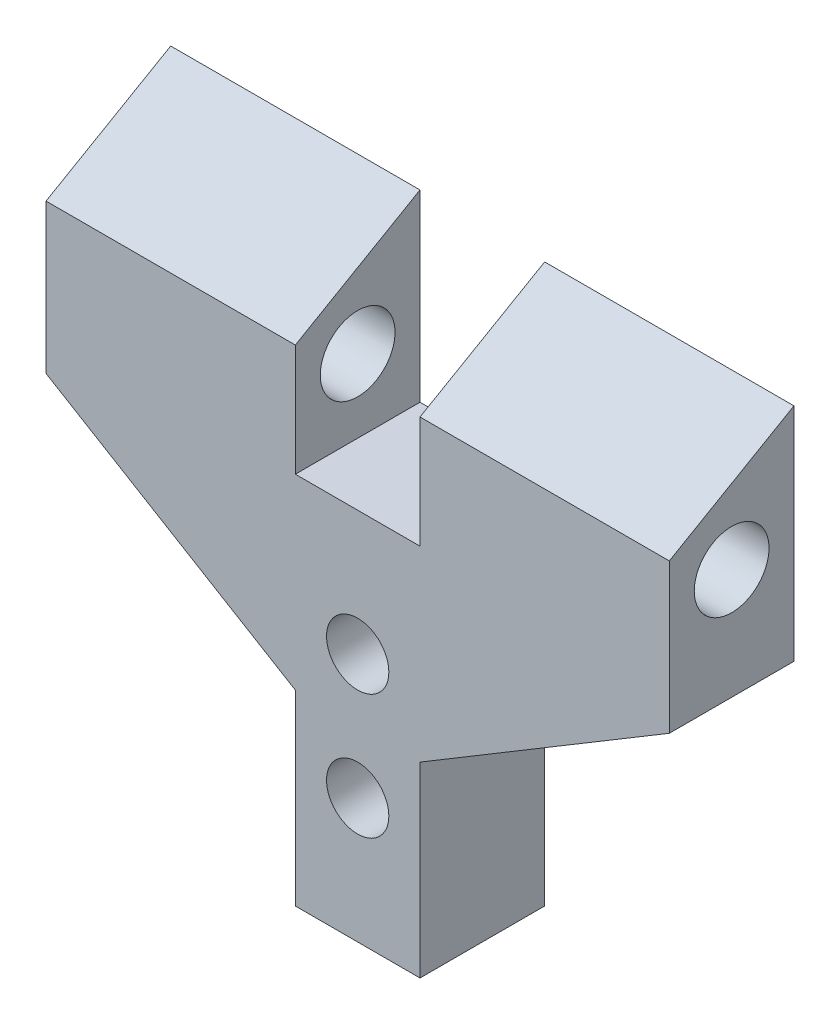
ISO-10303-21;
HEADER;
FILE_DESCRIPTION(('STEP AP214'),'2;1');
FILE_NAME('part.step','',(''),(''),'','','');
FILE_SCHEMA(('AUTOMOTIVE_DESIGN { 1 0 10303 214 1 1 1 1 }'));
ENDSEC;
DATA;
#1=APPLICATION_CONTEXT('core data for automotive mechanical design processes');
#2=APPLICATION_PROTOCOL_DEFINITION('international standard','automotive_design',2000,#1);
#3=PRODUCT_CONTEXT('',#1,'mechanical');
#4=PRODUCT('Part','Part','',(#3));
#5=PRODUCT_RELATED_PRODUCT_CATEGORY('part','',(#4));
#6=PRODUCT_DEFINITION_FORMATION('','',#4);
#7=PRODUCT_DEFINITION_CONTEXT('part definition',#1,'design');
#8=PRODUCT_DEFINITION('design','',#6,#7);
#9=PRODUCT_DEFINITION_SHAPE('','',#8);
#10=(LENGTH_UNIT() NAMED_UNIT(*) SI_UNIT(.MILLI.,.METRE.));
#11=(NAMED_UNIT(*) PLANE_ANGLE_UNIT() SI_UNIT($,.RADIAN.));
#12=(NAMED_UNIT(*) SI_UNIT($,.STERADIAN.) SOLID_ANGLE_UNIT());
#13=UNCERTAINTY_MEASURE_WITH_UNIT(LENGTH_MEASURE(1.E-05),#10,'distance_accuracy_value','');
#14=(GEOMETRIC_REPRESENTATION_CONTEXT(3) GLOBAL_UNCERTAINTY_ASSIGNED_CONTEXT((#13)) GLOBAL_UNIT_ASSIGNED_CONTEXT((#10,
#11,#12)) REPRESENTATION_CONTEXT('',''));
#15=CARTESIAN_POINT('',(0.,0.,0.));
#16=DIRECTION('',(0.,0.,1.));
#17=DIRECTION('',(1.,0.,0.));
#18=AXIS2_PLACEMENT_3D('',#15,#16,#17);
#19=CARTESIAN_POINT('',(5.,0.,10.));
#20=DIRECTION('',(-1.,0.,0.));
#21=DIRECTION('',(0.,0.,1.));
#22=AXIS2_PLACEMENT_3D('',#19,#20,#21);
#23=PLANE('',#22);
#24=DIRECTION('',(0.,1.,0.));
#25=VECTOR('',#24,1.);
#26=CARTESIAN_POINT('',(5.,0.,0.));
#27=LINE('',#26,#25);
#28=CARTESIAN_POINT('',(5.,-15.,0.));
#29=VERTEX_POINT('',#28);
#30=CARTESIAN_POINT('',(5.,0.,0.));
#31=VERTEX_POINT('',#30);
#32=EDGE_CURVE('E147',#29,#31,#27,.T.);
#33=ORIENTED_EDGE('',*,*,#32,.T.);
#34=DIRECTION('',(0.,0.,-1.));
#35=VECTOR('',#34,1.);
#36=CARTESIAN_POINT('',(5.,0.,10.));
#37=LINE('',#36,#35);
#38=CARTESIAN_POINT('',(5.,0.,10.));
#39=VERTEX_POINT('',#38);
#40=EDGE_CURVE('E11',#39,#31,#37,.T.);
#41=ORIENTED_EDGE('',*,*,#40,.F.);
#42=DIRECTION('',(0.,1.,0.));
#43=VECTOR('',#42,1.);
#44=CARTESIAN_POINT('',(5.,0.,10.));
#45=LINE('',#44,#43);
#46=CARTESIAN_POINT('',(5.,-15.,10.));
#47=VERTEX_POINT('',#46);
#48=EDGE_CURVE('E224',#47,#39,#45,.T.);
#49=ORIENTED_EDGE('',*,*,#48,.F.);
#50=DIRECTION('',(0.,0.,-1.));
#51=VECTOR('',#50,1.);
#52=CARTESIAN_POINT('',(5.,-15.,10.));
#53=LINE('',#52,#51);
#54=EDGE_CURVE('E136',#47,#29,#53,.T.);
#55=ORIENTED_EDGE('',*,*,#54,.T.);
#56=EDGE_LOOP('',(#33,#41,#49,#55));
#57=FACE_BOUND('',#56,.T.);
#58=ADVANCED_FACE('F34',(#57),#23,.F.);
#59=CARTESIAN_POINT('',(1.32352941176471,-2.20588235294118,10.));
#60=DIRECTION('',(-0.514495755427526,0.857492925712544,0.));
#61=DIRECTION('',(-0.857492925712544,-0.514495755427526,0.));
#62=AXIS2_PLACEMENT_3D('',#59,#60,#61);
#63=PLANE('',#62);
#64=DIRECTION('',(0.857492925712544,0.514495755427526,0.));
#65=VECTOR('',#64,1.);
#66=CARTESIAN_POINT('',(1.32352941176471,-2.20588235294118,0.));
#67=LINE('',#66,#65);
#68=CARTESIAN_POINT('',(25.,12.,0.));
#69=VERTEX_POINT('',#68);
#70=EDGE_CURVE('E150',#31,#69,#67,.T.);
#71=ORIENTED_EDGE('',*,*,#70,.T.);
#72=DIRECTION('',(0.,0.,-1.));
#73=VECTOR('',#72,1.);
#74=CARTESIAN_POINT('',(25.,12.,10.));
#75=LINE('',#74,#73);
#76=CARTESIAN_POINT('',(25.,12.,10.));
#77=VERTEX_POINT('',#76);
#78=EDGE_CURVE('E43',#77,#69,#75,.T.);
#79=ORIENTED_EDGE('',*,*,#78,.F.);
#80=DIRECTION('',(0.857492925712544,0.514495755427526,0.));
#81=VECTOR('',#80,1.);
#82=CARTESIAN_POINT('',(1.32352941176471,-2.20588235294118,10.));
#83=LINE('',#82,#81);
#84=EDGE_CURVE('E97',#39,#77,#83,.T.);
#85=ORIENTED_EDGE('',*,*,#84,.F.);
#86=ORIENTED_EDGE('',*,*,#40,.T.);
#87=EDGE_LOOP('',(#71,#79,#85,#86));
#88=FACE_BOUND('',#87,.T.);
#89=ADVANCED_FACE('F275',(#88),#63,.F.);
#90=CARTESIAN_POINT('',(25.,0.,10.));
#91=DIRECTION('',(-1.,0.,0.));
#92=DIRECTION('',(0.,0.,1.));
#93=AXIS2_PLACEMENT_3D('',#90,#91,#92);
#94=PLANE('',#93);
#95=CARTESIAN_POINT('',(25.,20.875,5.));
#96=DIRECTION('',(-1.,0.,0.));
#97=DIRECTION('',(0.,0.,1.));
#98=AXIS2_PLACEMENT_3D('',#95,#96,#97);
#99=CIRCLE('',#98,3.);
#100=CARTESIAN_POINT('',(25.,20.875,8.));
#101=VERTEX_POINT('',#100);
#102=EDGE_CURVE('E313',#101,#101,#99,.F.);
#103=ORIENTED_EDGE('',*,*,#102,.F.);
#104=EDGE_LOOP('',(#103));
#105=FACE_BOUND('',#104,.T.);
#106=DIRECTION('',(0.,1.,0.));
#107=VECTOR('',#106,1.);
#108=CARTESIAN_POINT('',(25.,0.,0.));
#109=LINE('',#108,#107);
#110=CARTESIAN_POINT('',(25.,29.75,0.));
#111=VERTEX_POINT('',#110);
#112=EDGE_CURVE('E152',#69,#111,#109,.T.);
#113=ORIENTED_EDGE('',*,*,#112,.T.);
#114=DIRECTION('',(0.,0.499999999999995,-0.866025403784442));
#115=VECTOR('',#114,1.);
#116=CARTESIAN_POINT('',(25.,23.9764973081038,10.));
#117=LINE('',#116,#115);
#118=CARTESIAN_POINT('',(25.,23.9764973081038,10.));
#119=VERTEX_POINT('',#118);
#120=EDGE_CURVE('E205',#119,#111,#117,.T.);
#121=ORIENTED_EDGE('',*,*,#120,.F.);
#122=DIRECTION('',(0.,1.,0.));
#123=VECTOR('',#122,1.);
#124=CARTESIAN_POINT('',(25.,0.,10.));
#125=LINE('',#124,#123);
#126=EDGE_CURVE('E191',#77,#119,#125,.T.);
#127=ORIENTED_EDGE('',*,*,#126,.F.);
#128=ORIENTED_EDGE('',*,*,#78,.T.);
#129=EDGE_LOOP('',(#113,#121,#127,#128));
#130=FACE_BOUND('',#129,.T.);
#131=ADVANCED_FACE('F188',(#105,#130),#94,.F.);
#132=CARTESIAN_POINT('',(5.,0.,10.));
#133=DIRECTION('',(-1.,0.,0.));
#134=DIRECTION('',(0.,0.,1.));
#135=AXIS2_PLACEMENT_3D('',#132,#133,#134);
#136=PLANE('',#135);
#137=CARTESIAN_POINT('',(5.,20.875,5.));
#138=DIRECTION('',(-1.,0.,0.));
#139=DIRECTION('',(0.,0.,1.));
#140=AXIS2_PLACEMENT_3D('',#137,#138,#139);
#141=CIRCLE('',#140,3.);
#142=CARTESIAN_POINT('',(5.,20.875,8.));
#143=VERTEX_POINT('',#142);
#144=EDGE_CURVE('E310',#143,#143,#141,.T.);
#145=ORIENTED_EDGE('',*,*,#144,.F.);
#146=EDGE_LOOP('',(#145));
#147=FACE_BOUND('',#146,.T.);
#148=DIRECTION('',(0.,-0.499999999999995,0.866025403784442));
#149=VECTOR('',#148,1.);
#150=CARTESIAN_POINT('',(5.,17.982372981078,20.3821278812935));
#151=LINE('',#150,#149);
#152=CARTESIAN_POINT('',(5.00000000000001,29.75,0.));
#153=VERTEX_POINT('',#152);
#154=CARTESIAN_POINT('',(5.00000000000001,23.9764973081038,10.));
#155=VERTEX_POINT('',#154);
#156=EDGE_CURVE('E144',#153,#155,#151,.T.);
#157=ORIENTED_EDGE('',*,*,#156,.F.);
#158=DIRECTION('',(0.,1.,0.));
#159=VECTOR('',#158,1.);
#160=CARTESIAN_POINT('',(5.,0.,0.));
#161=LINE('',#160,#159);
#162=CARTESIAN_POINT('',(5.,15.,0.));
#163=VERTEX_POINT('',#162);
#164=EDGE_CURVE('E158',#163,#153,#161,.T.);
#165=ORIENTED_EDGE('',*,*,#164,.F.);
#166=DIRECTION('',(0.,0.,-1.));
#167=VECTOR('',#166,1.);
#168=CARTESIAN_POINT('',(5.,15.,10.));
#169=LINE('',#168,#167);
#170=CARTESIAN_POINT('',(5.,15.,10.));
#171=VERTEX_POINT('',#170);
#172=EDGE_CURVE('E183',#171,#163,#169,.T.);
#173=ORIENTED_EDGE('',*,*,#172,.F.);
#174=DIRECTION('',(0.,1.,0.));
#175=VECTOR('',#174,1.);
#176=CARTESIAN_POINT('',(5.,0.,10.));
#177=LINE('',#176,#175);
#178=EDGE_CURVE('E212',#171,#155,#177,.T.);
#179=ORIENTED_EDGE('',*,*,#178,.T.);
#180=EDGE_LOOP('',(#157,#165,#173,#179));
#181=FACE_BOUND('',#180,.T.);
#182=ADVANCED_FACE('F210',(#147,#181),#136,.T.);
#183=CARTESIAN_POINT('',(0.,15.,10.));
#184=DIRECTION('',(0.,1.,0.));
#185=DIRECTION('',(0.,0.,1.));
#186=AXIS2_PLACEMENT_3D('',#183,#184,#185);
#187=PLANE('',#186);
#188=DIRECTION('',(1.,0.,0.));
#189=VECTOR('',#188,1.);
#190=CARTESIAN_POINT('',(0.,15.,0.));
#191=LINE('',#190,#189);
#192=CARTESIAN_POINT('',(-5.,15.,0.));
#193=VERTEX_POINT('',#192);
#194=EDGE_CURVE('E161',#193,#163,#191,.T.);
#195=ORIENTED_EDGE('',*,*,#194,.F.);
#196=DIRECTION('',(0.,0.,-1.));
#197=VECTOR('',#196,1.);
#198=CARTESIAN_POINT('',(-5.,15.,10.));
#199=LINE('',#198,#197);
#200=CARTESIAN_POINT('',(-5.,15.,10.));
#201=VERTEX_POINT('',#200);
#202=EDGE_CURVE('E181',#201,#193,#199,.T.);
#203=ORIENTED_EDGE('',*,*,#202,.F.);
#204=DIRECTION('',(1.,0.,0.));
#205=VECTOR('',#204,1.);
#206=CARTESIAN_POINT('',(0.,15.,10.));
#207=LINE('',#206,#205);
#208=EDGE_CURVE('E229',#201,#171,#207,.T.);
#209=ORIENTED_EDGE('',*,*,#208,.T.);
#210=ORIENTED_EDGE('',*,*,#172,.T.);
#211=EDGE_LOOP('',(#195,#203,#209,#210));
#212=FACE_BOUND('',#211,.T.);
#213=ADVANCED_FACE('F258',(#212),#187,.T.);
#214=CARTESIAN_POINT('',(-5.,0.,10.));
#215=DIRECTION('',(-1.,0.,0.));
#216=DIRECTION('',(0.,0.,1.));
#217=AXIS2_PLACEMENT_3D('',#214,#215,#216);
#218=PLANE('',#217);
#219=CARTESIAN_POINT('',(-5.,20.875,5.));
#220=DIRECTION('',(-1.,0.,0.));
#221=DIRECTION('',(0.,0.,1.));
#222=AXIS2_PLACEMENT_3D('',#219,#220,#221);
#223=CIRCLE('',#222,3.);
#224=CARTESIAN_POINT('',(-5.,20.875,8.));
#225=VERTEX_POINT('',#224);
#226=EDGE_CURVE('E315',#225,#225,#223,.T.);
#227=ORIENTED_EDGE('',*,*,#226,.T.);
#228=EDGE_LOOP('',(#227));
#229=FACE_BOUND('',#228,.T.);
#230=DIRECTION('',(0.,1.,0.));
#231=VECTOR('',#230,1.);
#232=CARTESIAN_POINT('',(-5.,0.,0.));
#233=LINE('',#232,#231);
#234=CARTESIAN_POINT('',(-5.,29.75,0.));
#235=VERTEX_POINT('',#234);
#236=EDGE_CURVE('E164',#193,#235,#233,.T.);
#237=ORIENTED_EDGE('',*,*,#236,.T.);
#238=DIRECTION('',(0.,-0.499999999999995,0.866025403784442));
#239=VECTOR('',#238,1.);
#240=CARTESIAN_POINT('',(-5.,17.982372981078,20.3821278812935));
#241=LINE('',#240,#239);
#242=CARTESIAN_POINT('',(-4.99999999999999,23.9764973081038,10.));
#243=VERTEX_POINT('',#242);
#244=EDGE_CURVE('E213',#235,#243,#241,.T.);
#245=ORIENTED_EDGE('',*,*,#244,.T.);
#246=DIRECTION('',(0.,1.,0.));
#247=VECTOR('',#246,1.);
#248=CARTESIAN_POINT('',(-5.,0.,10.));
#249=LINE('',#248,#247);
#250=EDGE_CURVE('E232',#201,#243,#249,.T.);
#251=ORIENTED_EDGE('',*,*,#250,.F.);
#252=ORIENTED_EDGE('',*,*,#202,.T.);
#253=EDGE_LOOP('',(#237,#245,#251,#252));
#254=FACE_BOUND('',#253,.T.);
#255=ADVANCED_FACE('F252',(#229,#254),#218,.F.);
#256=CARTESIAN_POINT('',(-25.,0.,10.));
#257=DIRECTION('',(-1.,0.,0.));
#258=DIRECTION('',(0.,-1.,0.));
#259=AXIS2_PLACEMENT_3D('',#256,#257,#258);
#260=PLANE('',#259);
#261=CARTESIAN_POINT('',(-25.,20.875,5.));
#262=DIRECTION('',(-1.,0.,0.));
#263=DIRECTION('',(0.,0.,1.));
#264=AXIS2_PLACEMENT_3D('',#261,#262,#263);
#265=CIRCLE('',#264,3.);
#266=CARTESIAN_POINT('',(-25.,20.875,8.));
#267=VERTEX_POINT('',#266);
#268=EDGE_CURVE('E316',#267,#267,#265,.T.);
#269=ORIENTED_EDGE('',*,*,#268,.F.);
#270=EDGE_LOOP('',(#269));
#271=FACE_BOUND('',#270,.T.);
#272=DIRECTION('',(0.,-0.499999999999995,0.866025403784442));
#273=VECTOR('',#272,1.);
#274=CARTESIAN_POINT('',(-25.,23.9764973081038,10.));
#275=LINE('',#274,#273);
#276=CARTESIAN_POINT('',(-25.,29.75,0.));
#277=VERTEX_POINT('',#276);
#278=CARTESIAN_POINT('',(-25.,23.9764973081038,10.));
#279=VERTEX_POINT('',#278);
#280=EDGE_CURVE('E241',#277,#279,#275,.T.);
#281=ORIENTED_EDGE('',*,*,#280,.F.);
#282=DIRECTION('',(0.,1.,0.));
#283=VECTOR('',#282,1.);
#284=CARTESIAN_POINT('',(-25.,0.,0.));
#285=LINE('',#284,#283);
#286=CARTESIAN_POINT('',(-25.,12.,0.));
#287=VERTEX_POINT('',#286);
#288=EDGE_CURVE('E170',#287,#277,#285,.T.);
#289=ORIENTED_EDGE('',*,*,#288,.F.);
#290=DIRECTION('',(0.,0.,-1.));
#291=VECTOR('',#290,1.);
#292=CARTESIAN_POINT('',(-25.,12.,10.));
#293=LINE('',#292,#291);
#294=CARTESIAN_POINT('',(-25.,12.,10.));
#295=VERTEX_POINT('',#294);
#296=EDGE_CURVE('E132',#295,#287,#293,.T.);
#297=ORIENTED_EDGE('',*,*,#296,.F.);
#298=DIRECTION('',(0.,1.,0.));
#299=VECTOR('',#298,1.);
#300=CARTESIAN_POINT('',(-25.,0.,10.));
#301=LINE('',#300,#299);
#302=EDGE_CURVE('E121',#295,#279,#301,.T.);
#303=ORIENTED_EDGE('',*,*,#302,.T.);
#304=EDGE_LOOP('',(#281,#289,#297,#303));
#305=FACE_BOUND('',#304,.T.);
#306=ADVANCED_FACE('F237',(#271,#305),#260,.T.);
#307=CARTESIAN_POINT('',(-1.32352941176471,-2.20588235294118,10.));
#308=DIRECTION('',(0.514495755427526,0.857492925712544,0.));
#309=DIRECTION('',(-0.857492925712544,0.514495755427526,0.));
#310=AXIS2_PLACEMENT_3D('',#307,#308,#309);
#311=PLANE('',#310);
#312=DIRECTION('',(0.857492925712544,-0.514495755427526,0.));
#313=VECTOR('',#312,1.);
#314=CARTESIAN_POINT('',(-1.32352941176471,-2.20588235294118,0.));
#315=LINE('',#314,#313);
#316=CARTESIAN_POINT('',(-5.,0.,0.));
#317=VERTEX_POINT('',#316);
#318=EDGE_CURVE('E128',#287,#317,#315,.T.);
#319=ORIENTED_EDGE('',*,*,#318,.T.);
#320=DIRECTION('',(0.,0.,-1.));
#321=VECTOR('',#320,1.);
#322=CARTESIAN_POINT('',(-5.,0.,10.));
#323=LINE('',#322,#321);
#324=CARTESIAN_POINT('',(-5.,0.,10.));
#325=VERTEX_POINT('',#324);
#326=EDGE_CURVE('E125',#325,#317,#323,.T.);
#327=ORIENTED_EDGE('',*,*,#326,.F.);
#328=DIRECTION('',(0.857492925712544,-0.514495755427526,0.));
#329=VECTOR('',#328,1.);
#330=CARTESIAN_POINT('',(-1.32352941176471,-2.20588235294118,10.));
#331=LINE('',#330,#329);
#332=EDGE_CURVE('E113',#295,#325,#331,.T.);
#333=ORIENTED_EDGE('',*,*,#332,.F.);
#334=ORIENTED_EDGE('',*,*,#296,.T.);
#335=EDGE_LOOP('',(#319,#327,#333,#334));
#336=FACE_BOUND('',#335,.T.);
#337=ADVANCED_FACE('F126',(#336),#311,.F.);
#338=CARTESIAN_POINT('',(-5.,0.,10.));
#339=DIRECTION('',(-1.,0.,0.));
#340=DIRECTION('',(0.,0.,1.));
#341=AXIS2_PLACEMENT_3D('',#338,#339,#340);
#342=PLANE('',#341);
#343=DIRECTION('',(0.,1.,0.));
#344=VECTOR('',#343,1.);
#345=CARTESIAN_POINT('',(-5.,0.,0.));
#346=LINE('',#345,#344);
#347=CARTESIAN_POINT('',(-5.,-15.,0.));
#348=VERTEX_POINT('',#347);
#349=EDGE_CURVE('E174',#348,#317,#346,.T.);
#350=ORIENTED_EDGE('',*,*,#349,.F.);
#351=DIRECTION('',(0.,0.,-1.));
#352=VECTOR('',#351,1.);
#353=CARTESIAN_POINT('',(-5.,-15.,10.));
#354=LINE('',#353,#352);
#355=CARTESIAN_POINT('',(-5.,-15.,10.));
#356=VERTEX_POINT('',#355);
#357=EDGE_CURVE('E86',#356,#348,#354,.T.);
#358=ORIENTED_EDGE('',*,*,#357,.F.);
#359=DIRECTION('',(0.,1.,0.));
#360=VECTOR('',#359,1.);
#361=CARTESIAN_POINT('',(-5.,0.,10.));
#362=LINE('',#361,#360);
#363=EDGE_CURVE('E119',#356,#325,#362,.T.);
#364=ORIENTED_EDGE('',*,*,#363,.T.);
#365=ORIENTED_EDGE('',*,*,#326,.T.);
#366=EDGE_LOOP('',(#350,#358,#364,#365));
#367=FACE_BOUND('',#366,.T.);
#368=ADVANCED_FACE('F134',(#367),#342,.T.);
#369=CARTESIAN_POINT('',(0.,-5.,10.));
#370=DIRECTION('',(0.,0.,-1.));
#371=DIRECTION('',(-1.,0.,0.));
#372=AXIS2_PLACEMENT_3D('',#369,#370,#371);
#373=CYLINDRICAL_SURFACE('',#372,2.5);
#374=CARTESIAN_POINT('',(0.,-5.,10.));
#375=DIRECTION('',(0.,0.,1.));
#376=DIRECTION('',(1.,0.,0.));
#377=AXIS2_PLACEMENT_3D('',#374,#375,#376);
#378=CIRCLE('',#377,2.5);
#379=CARTESIAN_POINT('',(2.5,-5.,10.));
#380=VERTEX_POINT('',#379);
#381=EDGE_CURVE('E221',#380,#380,#378,.T.);
#382=ORIENTED_EDGE('',*,*,#381,.T.);
#383=EDGE_LOOP('',(#382));
#384=FACE_BOUND('',#383,.T.);
#385=CARTESIAN_POINT('',(0.,-5.,0.));
#386=DIRECTION('',(0.,0.,1.));
#387=DIRECTION('',(1.,0.,0.));
#388=AXIS2_PLACEMENT_3D('',#385,#386,#387);
#389=CIRCLE('',#388,2.5);
#390=CARTESIAN_POINT('',(2.5,-5.,0.));
#391=VERTEX_POINT('',#390);
#392=EDGE_CURVE('E143',#391,#391,#389,.T.);
#393=ORIENTED_EDGE('',*,*,#392,.F.);
#394=EDGE_LOOP('',(#393));
#395=FACE_BOUND('',#394,.T.);
#396=ADVANCED_FACE('F270',(#384,#395),#373,.F.);
#397=CARTESIAN_POINT('',(0.,5.,10.));
#398=DIRECTION('',(0.,0.,-1.));
#399=DIRECTION('',(-1.,0.,0.));
#400=AXIS2_PLACEMENT_3D('',#397,#398,#399);
#401=CYLINDRICAL_SURFACE('',#400,2.5);
#402=CARTESIAN_POINT('',(0.,5.,10.));
#403=DIRECTION('',(0.,0.,1.));
#404=DIRECTION('',(1.,0.,0.));
#405=AXIS2_PLACEMENT_3D('',#402,#403,#404);
#406=CIRCLE('',#405,2.5);
#407=CARTESIAN_POINT('',(2.5,5.,10.));
#408=VERTEX_POINT('',#407);
#409=EDGE_CURVE('E177',#408,#408,#406,.T.);
#410=ORIENTED_EDGE('',*,*,#409,.T.);
#411=EDGE_LOOP('',(#410));
#412=FACE_BOUND('',#411,.T.);
#413=CARTESIAN_POINT('',(0.,5.,0.));
#414=DIRECTION('',(0.,0.,1.));
#415=DIRECTION('',(1.,0.,0.));
#416=AXIS2_PLACEMENT_3D('',#413,#414,#415);
#417=CIRCLE('',#416,2.5);
#418=CARTESIAN_POINT('',(2.5,5.,0.));
#419=VERTEX_POINT('',#418);
#420=EDGE_CURVE('E140',#419,#419,#417,.T.);
#421=ORIENTED_EDGE('',*,*,#420,.F.);
#422=EDGE_LOOP('',(#421));
#423=FACE_BOUND('',#422,.T.);
#424=ADVANCED_FACE('F36',(#412,#423),#401,.F.);
#425=CARTESIAN_POINT('',(0.,-15.,10.));
#426=DIRECTION('',(0.,1.,0.));
#427=DIRECTION('',(0.,0.,1.));
#428=AXIS2_PLACEMENT_3D('',#425,#426,#427);
#429=PLANE('',#428);
#430=DIRECTION('',(1.,0.,0.));
#431=VECTOR('',#430,1.);
#432=CARTESIAN_POINT('',(0.,-15.,0.));
#433=LINE('',#432,#431);
#434=EDGE_CURVE('E89',#348,#29,#433,.T.);
#435=ORIENTED_EDGE('',*,*,#434,.T.);
#436=ORIENTED_EDGE('',*,*,#54,.F.);
#437=DIRECTION('',(1.,0.,0.));
#438=VECTOR('',#437,1.);
#439=CARTESIAN_POINT('',(0.,-15.,10.));
#440=LINE('',#439,#438);
#441=EDGE_CURVE('E51',#356,#47,#440,.T.);
#442=ORIENTED_EDGE('',*,*,#441,.F.);
#443=ORIENTED_EDGE('',*,*,#357,.T.);
#444=EDGE_LOOP('',(#435,#436,#442,#443));
#445=FACE_BOUND('',#444,.T.);
#446=ADVANCED_FACE('F262',(#445),#429,.F.);
#447=CARTESIAN_POINT('',(0.,0.,10.));
#448=DIRECTION('',(0.,0.,1.));
#449=DIRECTION('',(1.,0.,0.));
#450=AXIS2_PLACEMENT_3D('',#447,#448,#449);
#451=PLANE('',#450);
#452=DIRECTION('',(-1.,0.,0.));
#453=VECTOR('',#452,1.);
#454=CARTESIAN_POINT('',(36.5470053837925,23.9764973081038,10.));
#455=LINE('',#454,#453);
#456=EDGE_CURVE('E247',#243,#279,#455,.T.);
#457=ORIENTED_EDGE('',*,*,#456,.T.);
#458=ORIENTED_EDGE('',*,*,#302,.F.);
#459=ORIENTED_EDGE('',*,*,#332,.T.);
#460=ORIENTED_EDGE('',*,*,#363,.F.);
#461=ORIENTED_EDGE('',*,*,#441,.T.);
#462=ORIENTED_EDGE('',*,*,#48,.T.);
#463=ORIENTED_EDGE('',*,*,#84,.T.);
#464=ORIENTED_EDGE('',*,*,#126,.T.);
#465=EDGE_CURVE('E249',#119,#155,#455,.T.);
#466=ORIENTED_EDGE('',*,*,#465,.T.);
#467=ORIENTED_EDGE('',*,*,#178,.F.);
#468=ORIENTED_EDGE('',*,*,#208,.F.);
#469=ORIENTED_EDGE('',*,*,#250,.T.);
#470=EDGE_LOOP('',(#457,#458,#459,#460,#461,#462,#463,#464,#466,#467,#468,#469));
#471=FACE_BOUND('',#470,.T.);
#472=ORIENTED_EDGE('',*,*,#409,.F.);
#473=EDGE_LOOP('',(#472));
#474=FACE_BOUND('',#473,.T.);
#475=ORIENTED_EDGE('',*,*,#381,.F.);
#476=EDGE_LOOP('',(#475));
#477=FACE_BOUND('',#476,.T.);
#478=ADVANCED_FACE('F116',(#471,#474,#477),#451,.T.);
#479=CARTESIAN_POINT('',(0.,0.,0.));
#480=DIRECTION('',(0.,0.,1.));
#481=DIRECTION('',(1.,0.,0.));
#482=AXIS2_PLACEMENT_3D('',#479,#480,#481);
#483=PLANE('',#482);
#484=ORIENTED_EDGE('',*,*,#420,.T.);
#485=EDGE_LOOP('',(#484));
#486=FACE_BOUND('',#485,.T.);
#487=ORIENTED_EDGE('',*,*,#392,.T.);
#488=EDGE_LOOP('',(#487));
#489=FACE_BOUND('',#488,.T.);
#490=ORIENTED_EDGE('',*,*,#32,.F.);
#491=ORIENTED_EDGE('',*,*,#434,.F.);
#492=ORIENTED_EDGE('',*,*,#349,.T.);
#493=ORIENTED_EDGE('',*,*,#318,.F.);
#494=ORIENTED_EDGE('',*,*,#288,.T.);
#495=DIRECTION('',(-1.,0.,0.));
#496=VECTOR('',#495,1.);
#497=CARTESIAN_POINT('',(0.,29.75,0.));
#498=LINE('',#497,#496);
#499=EDGE_CURVE('E167',#235,#277,#498,.T.);
#500=ORIENTED_EDGE('',*,*,#499,.F.);
#501=ORIENTED_EDGE('',*,*,#236,.F.);
#502=ORIENTED_EDGE('',*,*,#194,.T.);
#503=ORIENTED_EDGE('',*,*,#164,.T.);
#504=DIRECTION('',(1.,0.,0.));
#505=VECTOR('',#504,1.);
#506=CARTESIAN_POINT('',(0.,29.75,0.));
#507=LINE('',#506,#505);
#508=EDGE_CURVE('E155',#153,#111,#507,.T.);
#509=ORIENTED_EDGE('',*,*,#508,.T.);
#510=ORIENTED_EDGE('',*,*,#112,.F.);
#511=ORIENTED_EDGE('',*,*,#70,.F.);
#512=EDGE_LOOP('',(#490,#491,#492,#493,#494,#500,#501,#502,#503,#509,#510,#511));
#513=FACE_BOUND('',#512,.T.);
#514=ADVANCED_FACE('F194',(#486,#489,#513),#483,.F.);
#515=CARTESIAN_POINT('',(36.5470053837925,23.9764973081038,10.));
#516=DIRECTION('',(0.,-0.866025403784442,-0.499999999999995));
#517=DIRECTION('',(0.,0.499999999999995,-0.866025403784442));
#518=AXIS2_PLACEMENT_3D('',#515,#516,#517);
#519=PLANE('',#518);
#520=ORIENTED_EDGE('',*,*,#499,.T.);
#521=ORIENTED_EDGE('',*,*,#280,.T.);
#522=ORIENTED_EDGE('',*,*,#456,.F.);
#523=ORIENTED_EDGE('',*,*,#244,.F.);
#524=EDGE_LOOP('',(#520,#521,#522,#523));
#525=FACE_BOUND('',#524,.T.);
#526=ADVANCED_FACE('F248',(#525),#519,.F.);
#527=ORIENTED_EDGE('',*,*,#156,.T.);
#528=ORIENTED_EDGE('',*,*,#465,.F.);
#529=ORIENTED_EDGE('',*,*,#120,.T.);
#530=ORIENTED_EDGE('',*,*,#508,.F.);
#531=EDGE_LOOP('',(#527,#528,#529,#530));
#532=FACE_BOUND('',#531,.T.);
#533=ADVANCED_FACE('F201',(#532),#519,.F.);
#534=CARTESIAN_POINT('',(36.5470053837925,20.875,5.));
#535=DIRECTION('',(-1.,0.,0.));
#536=DIRECTION('',(0.,0.,1.));
#537=AXIS2_PLACEMENT_3D('',#534,#535,#536);
#538=CYLINDRICAL_SURFACE('',#537,3.);
#539=CARTESIAN_POINT('',(-25.,20.875,8.));
#540=CARTESIAN_POINT('',(-24.7916666666667,20.875,8.));
#541=CARTESIAN_POINT('',(-24.5833333333333,20.875,8.));
#542=CARTESIAN_POINT('',(-24.1666666666667,20.875,8.));
#543=CARTESIAN_POINT('',(-23.9583333333333,20.875,8.));
#544=CARTESIAN_POINT('',(-23.5416666666667,20.875,8.));
#545=CARTESIAN_POINT('',(-23.3333333333333,20.875,8.));
#546=CARTESIAN_POINT('',(-22.9166666666667,20.875,8.));
#547=CARTESIAN_POINT('',(-22.7083333333333,20.875,8.));
#548=CARTESIAN_POINT('',(-22.2916666666667,20.875,8.));
#549=CARTESIAN_POINT('',(-22.0833333333333,20.875,8.));
#550=CARTESIAN_POINT('',(-21.6666666666667,20.875,8.));
#551=CARTESIAN_POINT('',(-21.4583333333333,20.875,8.));
#552=CARTESIAN_POINT('',(-21.0416666666667,20.875,8.));
#553=CARTESIAN_POINT('',(-20.8333333333333,20.875,8.));
#554=CARTESIAN_POINT('',(-20.4166666666667,20.875,8.));
#555=CARTESIAN_POINT('',(-20.2083333333333,20.875,8.));
#556=CARTESIAN_POINT('',(-19.7916666666667,20.875,8.));
#557=CARTESIAN_POINT('',(-19.5833333333333,20.875,8.));
#558=CARTESIAN_POINT('',(-19.1666666666667,20.875,8.));
#559=CARTESIAN_POINT('',(-18.9583333333333,20.875,8.));
#560=CARTESIAN_POINT('',(-18.5416666666667,20.875,8.));
#561=CARTESIAN_POINT('',(-18.3333333333333,20.875,8.));
#562=CARTESIAN_POINT('',(-17.9166666666667,20.875,8.));
#563=CARTESIAN_POINT('',(-17.7083333333333,20.875,8.));
#564=CARTESIAN_POINT('',(-17.2916666666667,20.875,8.));
#565=CARTESIAN_POINT('',(-17.0833333333333,20.875,8.));
#566=CARTESIAN_POINT('',(-16.6666666666667,20.875,8.));
#567=CARTESIAN_POINT('',(-16.4583333333333,20.875,8.));
#568=CARTESIAN_POINT('',(-16.0416666666667,20.875,8.));
#569=CARTESIAN_POINT('',(-15.8333333333333,20.875,8.));
#570=CARTESIAN_POINT('',(-15.4166666666667,20.875,8.));
#571=CARTESIAN_POINT('',(-15.2083333333333,20.875,8.));
#572=CARTESIAN_POINT('',(-14.7916666666667,20.875,8.));
#573=CARTESIAN_POINT('',(-14.5833333333333,20.875,8.));
#574=CARTESIAN_POINT('',(-14.1666666666667,20.875,8.));
#575=CARTESIAN_POINT('',(-13.9583333333333,20.875,8.));
#576=CARTESIAN_POINT('',(-13.5416666666667,20.875,8.));
#577=CARTESIAN_POINT('',(-13.3333333333333,20.875,8.));
#578=CARTESIAN_POINT('',(-12.9166666666667,20.875,8.));
#579=CARTESIAN_POINT('',(-12.7083333333333,20.875,8.));
#580=CARTESIAN_POINT('',(-12.2916666666667,20.875,8.));
#581=CARTESIAN_POINT('',(-12.0833333333333,20.875,8.));
#582=CARTESIAN_POINT('',(-11.6666666666667,20.875,8.));
#583=CARTESIAN_POINT('',(-11.4583333333333,20.875,8.));
#584=CARTESIAN_POINT('',(-11.0416666666667,20.875,8.));
#585=CARTESIAN_POINT('',(-10.8333333333333,20.875,8.));
#586=CARTESIAN_POINT('',(-10.4166666666667,20.875,8.));
#587=CARTESIAN_POINT('',(-10.2083333333333,20.875,8.));
#588=CARTESIAN_POINT('',(-9.79166666666667,20.875,8.));
#589=CARTESIAN_POINT('',(-9.58333333333333,20.875,8.));
#590=CARTESIAN_POINT('',(-9.16666666666667,20.875,8.));
#591=CARTESIAN_POINT('',(-8.95833333333333,20.875,8.));
#592=CARTESIAN_POINT('',(-8.54166666666667,20.875,8.));
#593=CARTESIAN_POINT('',(-8.33333333333333,20.875,8.));
#594=CARTESIAN_POINT('',(-7.91666666666667,20.875,8.));
#595=CARTESIAN_POINT('',(-7.70833333333333,20.875,8.));
#596=CARTESIAN_POINT('',(-7.29166666666667,20.875,8.));
#597=CARTESIAN_POINT('',(-7.08333333333333,20.875,8.));
#598=CARTESIAN_POINT('',(-6.66666666666667,20.875,8.));
#599=CARTESIAN_POINT('',(-6.45833333333333,20.875,8.));
#600=CARTESIAN_POINT('',(-6.04166666666667,20.875,8.));
#601=CARTESIAN_POINT('',(-5.83333333333333,20.875,8.));
#602=CARTESIAN_POINT('',(-5.41666666666666,20.875,8.));
#603=CARTESIAN_POINT('',(-5.20833333333333,20.875,8.));
#604=CARTESIAN_POINT('',(-5.,20.875,8.));
#605=B_SPLINE_CURVE_WITH_KNOTS('',3,(#539,#540,#541,#542,#543,#544,#545,#546,#547,#548,#549,
#550,#551,#552,#553,#554,#555,#556,#557,#558,#559,#560,#561,#562,#563,#564,#565,#566,#567,#568,
#569,#570,#571,#572,#573,#574,#575,#576,#577,#578,#579,#580,#581,#582,#583,#584,#585,#586,#587,
#588,#589,#590,#591,#592,#593,#594,#595,#596,#597,#598,#599,#600,#601,#602,#603,#604),
.UNSPECIFIED.,.F.,.F.,(4,2,2,2,2,2,2,2,2,2,2,2,2,2,2,2,2,2,2,2,2,2,2,2,2,2,2,2,2,2,2,2,4),(0.,
0.625000000000001,1.25,1.875,2.5,3.125,3.75,4.375,5.,5.62500000000001,6.25,6.875,7.5,8.125,8.75,
9.375,10.,10.625,11.25,11.875,12.5,13.125,13.75,14.375,15.,15.625,16.25,16.875,17.5,18.125,
18.75,19.375,20.),.UNSPECIFIED.);
#606=EDGE_CURVE('BSEAM299',#267,#225,#605,.T.);
#607=ORIENTED_EDGE('',*,*,#268,.T.);
#608=ORIENTED_EDGE('',*,*,#226,.F.);
#609=ORIENTED_EDGE('',*,*,#606,.T.);
#610=ORIENTED_EDGE('',*,*,#606,.F.);
#611=EDGE_LOOP('',(#607,#609,#608,#610));
#612=FACE_BOUND('',#611,.T.);
#613=ADVANCED_FACE('F299',(#612),#538,.F.);
#614=CARTESIAN_POINT('',(5.,20.875,8.));
#615=CARTESIAN_POINT('',(5.20833333333333,20.875,8.));
#616=CARTESIAN_POINT('',(5.41666666666666,20.875,8.));
#617=CARTESIAN_POINT('',(5.83333333333333,20.875,8.));
#618=CARTESIAN_POINT('',(6.04166666666666,20.875,8.));
#619=CARTESIAN_POINT('',(6.45833333333333,20.875,8.));
#620=CARTESIAN_POINT('',(6.66666666666666,20.875,8.));
#621=CARTESIAN_POINT('',(7.08333333333333,20.875,8.));
#622=CARTESIAN_POINT('',(7.29166666666666,20.875,8.));
#623=CARTESIAN_POINT('',(7.70833333333333,20.875,8.));
#624=CARTESIAN_POINT('',(7.91666666666666,20.875,8.));
#625=CARTESIAN_POINT('',(8.33333333333333,20.875,8.));
#626=CARTESIAN_POINT('',(8.54166666666666,20.875,8.));
#627=CARTESIAN_POINT('',(8.95833333333333,20.875,8.));
#628=CARTESIAN_POINT('',(9.16666666666666,20.875,8.));
#629=CARTESIAN_POINT('',(9.58333333333333,20.875,8.));
#630=CARTESIAN_POINT('',(9.79166666666667,20.875,8.));
#631=CARTESIAN_POINT('',(10.2083333333333,20.875,8.));
#632=CARTESIAN_POINT('',(10.4166666666667,20.875,8.));
#633=CARTESIAN_POINT('',(10.8333333333333,20.875,8.));
#634=CARTESIAN_POINT('',(11.0416666666667,20.875,8.));
#635=CARTESIAN_POINT('',(11.4583333333333,20.875,8.));
#636=CARTESIAN_POINT('',(11.6666666666667,20.875,8.));
#637=CARTESIAN_POINT('',(12.0833333333333,20.875,8.));
#638=CARTESIAN_POINT('',(12.2916666666667,20.875,8.));
#639=CARTESIAN_POINT('',(12.7083333333333,20.875,8.));
#640=CARTESIAN_POINT('',(12.9166666666667,20.875,8.));
#641=CARTESIAN_POINT('',(13.3333333333333,20.875,8.));
#642=CARTESIAN_POINT('',(13.5416666666667,20.875,8.));
#643=CARTESIAN_POINT('',(13.9583333333333,20.875,8.));
#644=CARTESIAN_POINT('',(14.1666666666667,20.875,8.));
#645=CARTESIAN_POINT('',(14.5833333333333,20.875,8.));
#646=CARTESIAN_POINT('',(14.7916666666667,20.875,8.));
#647=CARTESIAN_POINT('',(15.2083333333333,20.875,8.));
#648=CARTESIAN_POINT('',(15.4166666666667,20.875,8.));
#649=CARTESIAN_POINT('',(15.8333333333333,20.875,8.));
#650=CARTESIAN_POINT('',(16.0416666666667,20.875,8.));
#651=CARTESIAN_POINT('',(16.4583333333333,20.875,8.));
#652=CARTESIAN_POINT('',(16.6666666666667,20.875,8.));
#653=CARTESIAN_POINT('',(17.0833333333333,20.875,8.));
#654=CARTESIAN_POINT('',(17.2916666666667,20.875,8.));
#655=CARTESIAN_POINT('',(17.7083333333333,20.875,8.));
#656=CARTESIAN_POINT('',(17.9166666666667,20.875,8.));
#657=CARTESIAN_POINT('',(18.3333333333333,20.875,8.));
#658=CARTESIAN_POINT('',(18.5416666666667,20.875,8.));
#659=CARTESIAN_POINT('',(18.9583333333333,20.875,8.));
#660=CARTESIAN_POINT('',(19.1666666666667,20.875,8.));
#661=CARTESIAN_POINT('',(19.5833333333333,20.875,8.));
#662=CARTESIAN_POINT('',(19.7916666666667,20.875,8.));
#663=CARTESIAN_POINT('',(20.2083333333333,20.875,8.));
#664=CARTESIAN_POINT('',(20.4166666666667,20.875,8.));
#665=CARTESIAN_POINT('',(20.8333333333333,20.875,8.));
#666=CARTESIAN_POINT('',(21.0416666666667,20.875,8.));
#667=CARTESIAN_POINT('',(21.4583333333333,20.875,8.));
#668=CARTESIAN_POINT('',(21.6666666666667,20.875,8.));
#669=CARTESIAN_POINT('',(22.0833333333333,20.875,8.));
#670=CARTESIAN_POINT('',(22.2916666666667,20.875,8.));
#671=CARTESIAN_POINT('',(22.7083333333333,20.875,8.));
#672=CARTESIAN_POINT('',(22.9166666666667,20.875,8.));
#673=CARTESIAN_POINT('',(23.3333333333333,20.875,8.));
#674=CARTESIAN_POINT('',(23.5416666666667,20.875,8.));
#675=CARTESIAN_POINT('',(23.9583333333333,20.875,8.));
#676=CARTESIAN_POINT('',(24.1666666666667,20.875,8.));
#677=CARTESIAN_POINT('',(24.5833333333333,20.875,8.));
#678=CARTESIAN_POINT('',(24.7916666666667,20.875,8.));
#679=CARTESIAN_POINT('',(25.,20.875,8.));
#680=B_SPLINE_CURVE_WITH_KNOTS('',3,(#614,#615,#616,#617,#618,#619,#620,#621,#622,#623,#624,
#625,#626,#627,#628,#629,#630,#631,#632,#633,#634,#635,#636,#637,#638,#639,#640,#641,#642,#643,
#644,#645,#646,#647,#648,#649,#650,#651,#652,#653,#654,#655,#656,#657,#658,#659,#660,#661,#662,
#663,#664,#665,#666,#667,#668,#669,#670,#671,#672,#673,#674,#675,#676,#677,#678,#679),
.UNSPECIFIED.,.F.,.F.,(4,2,2,2,2,2,2,2,2,2,2,2,2,2,2,2,2,2,2,2,2,2,2,2,2,2,2,2,2,2,2,2,4),(0.,
0.624999999999997,1.25,1.875,2.5,3.125,3.75,4.375,5.,5.625,6.25,6.875,7.5,8.125,8.75,9.375,10.,
10.625,11.25,11.875,12.5,13.125,13.75,14.375,15.,15.625,16.25,16.875,17.5,18.125,18.75,19.375,
20.),.UNSPECIFIED.);
#681=EDGE_CURVE('BSEAM300',#143,#101,#680,.T.);
#682=ORIENTED_EDGE('',*,*,#144,.T.);
#683=ORIENTED_EDGE('',*,*,#102,.T.);
#684=ORIENTED_EDGE('',*,*,#681,.T.);
#685=ORIENTED_EDGE('',*,*,#681,.F.);
#686=EDGE_LOOP('',(#682,#684,#683,#685));
#687=FACE_BOUND('',#686,.T.);
#688=ADVANCED_FACE('F300',(#687),#538,.F.);
#689=CLOSED_SHELL('',(#58,#89,#131,#182,#213,#255,#306,#337,#368,#396,#424,#446,#478,#514,#526,
#533,#613,#688));
#690=MANIFOLD_SOLID_BREP('B2',#689);
#691=ADVANCED_BREP_SHAPE_REPRESENTATION('',(#18,#690),#14);
#692=SHAPE_DEFINITION_REPRESENTATION(#9,#691);
ENDSEC;
END-ISO-10303-21;
